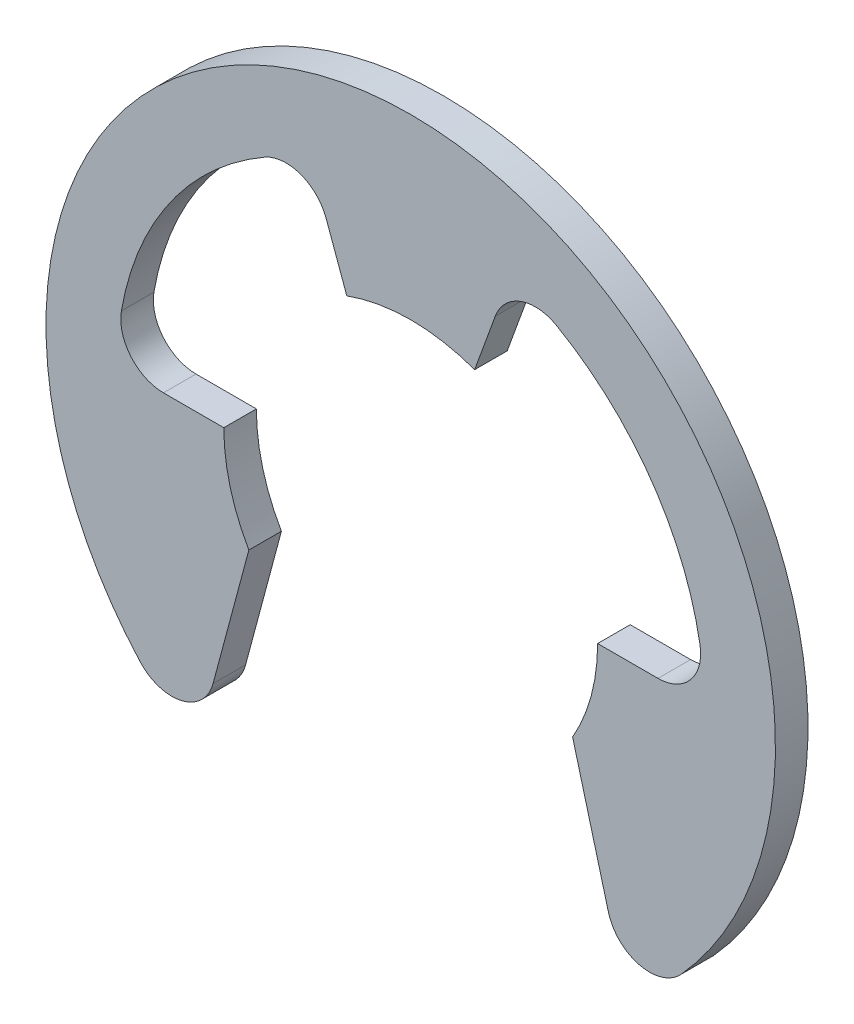
ISO-10303-21;
HEADER;
FILE_DESCRIPTION(('STEP AP214'),'2;1');
FILE_NAME('part.step','',(''),(''),'','','');
FILE_SCHEMA(('AUTOMOTIVE_DESIGN { 1 0 10303 214 1 1 1 1 }'));
ENDSEC;
DATA;
#1=APPLICATION_CONTEXT('core data for automotive mechanical design processes');
#2=APPLICATION_PROTOCOL_DEFINITION('international standard','automotive_design',2000,#1);
#3=PRODUCT_CONTEXT('',#1,'mechanical');
#4=PRODUCT('Part','Part','',(#3));
#5=PRODUCT_RELATED_PRODUCT_CATEGORY('part','',(#4));
#6=PRODUCT_DEFINITION_FORMATION('','',#4);
#7=PRODUCT_DEFINITION_CONTEXT('part definition',#1,'design');
#8=PRODUCT_DEFINITION('design','',#6,#7);
#9=PRODUCT_DEFINITION_SHAPE('','',#8);
#10=(LENGTH_UNIT() NAMED_UNIT(*) SI_UNIT(.MILLI.,.METRE.));
#11=(NAMED_UNIT(*) PLANE_ANGLE_UNIT() SI_UNIT($,.RADIAN.));
#12=(NAMED_UNIT(*) SI_UNIT($,.STERADIAN.) SOLID_ANGLE_UNIT());
#13=UNCERTAINTY_MEASURE_WITH_UNIT(LENGTH_MEASURE(1.E-05),#10,'distance_accuracy_value','');
#14=(GEOMETRIC_REPRESENTATION_CONTEXT(3) GLOBAL_UNCERTAINTY_ASSIGNED_CONTEXT((#13)) GLOBAL_UNIT_ASSIGNED_CONTEXT((#10,
#11,#12)) REPRESENTATION_CONTEXT('',''));
#15=CARTESIAN_POINT('',(0.,0.,0.));
#16=DIRECTION('',(0.,0.,1.));
#17=DIRECTION('',(1.,0.,0.));
#18=AXIS2_PLACEMENT_3D('',#15,#16,#17);
#19=CARTESIAN_POINT('',(0.,0.,-1.27));
#20=DIRECTION('',(0.,0.,1.));
#21=DIRECTION('',(1.,0.,0.));
#22=AXIS2_PLACEMENT_3D('',#19,#20,#21);
#23=CYLINDRICAL_SURFACE('',#22,7.2898);
#24=CARTESIAN_POINT('',(0.,0.,0.));
#25=DIRECTION('',(0.,0.,-1.));
#26=DIRECTION('',(1.,0.,0.));
#27=AXIS2_PLACEMENT_3D('',#24,#25,#26);
#28=CIRCLE('',#27,7.2898);
#29=CARTESIAN_POINT('',(7.2898,0.,0.));
#30=VERTEX_POINT('',#29);
#31=CARTESIAN_POINT('',(6.3131519885078,-3.64490000000001,0.));
#32=VERTEX_POINT('',#31);
#33=EDGE_CURVE('E190',#30,#32,#28,.T.);
#34=ORIENTED_EDGE('',*,*,#33,.F.);
#35=DIRECTION('',(0.,0.,1.));
#36=VECTOR('',#35,1.);
#37=CARTESIAN_POINT('',(7.2898,0.,-1.27));
#38=LINE('',#37,#36);
#39=CARTESIAN_POINT('',(7.2898,0.,-1.27));
#40=VERTEX_POINT('',#39);
#41=EDGE_CURVE('E11',#40,#30,#38,.T.);
#42=ORIENTED_EDGE('',*,*,#41,.F.);
#43=CARTESIAN_POINT('',(0.,0.,-1.27));
#44=DIRECTION('',(0.,0.,-1.));
#45=DIRECTION('',(1.,0.,0.));
#46=AXIS2_PLACEMENT_3D('',#43,#44,#45);
#47=CIRCLE('',#46,7.2898);
#48=CARTESIAN_POINT('',(6.3131519885078,-3.64490000000001,-1.27));
#49=VERTEX_POINT('',#48);
#50=EDGE_CURVE('E240',#40,#49,#47,.T.);
#51=ORIENTED_EDGE('',*,*,#50,.T.);
#52=DIRECTION('',(0.,0.,1.));
#53=VECTOR('',#52,1.);
#54=CARTESIAN_POINT('',(6.3131519885078,-3.64490000000001,-1.27));
#55=LINE('',#54,#53);
#56=EDGE_CURVE('E36',#49,#32,#55,.T.);
#57=ORIENTED_EDGE('',*,*,#56,.T.);
#58=EDGE_LOOP('',(#34,#42,#51,#57));
#59=FACE_BOUND('',#58,.T.);
#60=ADVANCED_FACE('F33',(#59),#23,.F.);
#61=CARTESIAN_POINT('',(7.2898,0.,-1.27));
#62=DIRECTION('',(0.,1.,0.));
#63=DIRECTION('',(-1.,0.,0.));
#64=AXIS2_PLACEMENT_3D('',#61,#62,#63);
#65=PLANE('',#64);
#66=DIRECTION('',(-1.,0.,0.));
#67=VECTOR('',#66,1.);
#68=CARTESIAN_POINT('',(7.2898,0.,0.));
#69=LINE('',#68,#67);
#70=CARTESIAN_POINT('',(9.64356779461212,0.,0.));
#71=VERTEX_POINT('',#70);
#72=EDGE_CURVE('E238',#71,#30,#69,.T.);
#73=ORIENTED_EDGE('',*,*,#72,.F.);
#74=DIRECTION('',(0.,0.,1.));
#75=VECTOR('',#74,1.);
#76=CARTESIAN_POINT('',(9.64356779461212,0.,-1.27));
#77=LINE('',#76,#75);
#78=CARTESIAN_POINT('',(9.64356779461212,0.,-1.27));
#79=VERTEX_POINT('',#78);
#80=EDGE_CURVE('E42',#79,#71,#77,.T.);
#81=ORIENTED_EDGE('',*,*,#80,.F.);
#82=DIRECTION('',(-1.,0.,0.));
#83=VECTOR('',#82,1.);
#84=CARTESIAN_POINT('',(7.2898,0.,-1.27));
#85=LINE('',#84,#83);
#86=EDGE_CURVE('E180',#79,#40,#85,.T.);
#87=ORIENTED_EDGE('',*,*,#86,.T.);
#88=ORIENTED_EDGE('',*,*,#41,.T.);
#89=EDGE_LOOP('',(#73,#81,#87,#88));
#90=FACE_BOUND('',#89,.T.);
#91=ADVANCED_FACE('F272',(#90),#65,.T.);
#92=CARTESIAN_POINT('',(9.64356779461212,1.664208,-1.27));
#93=DIRECTION('',(0.,0.,1.));
#94=DIRECTION('',(1.,0.,0.));
#95=AXIS2_PLACEMENT_3D('',#92,#93,#94);
#96=CYLINDRICAL_SURFACE('',#95,1.664208);
#97=CARTESIAN_POINT('',(9.64356779461212,1.664208,0.));
#98=DIRECTION('',(0.,0.,-1.));
#99=DIRECTION('',(1.,0.,0.));
#100=AXIS2_PLACEMENT_3D('',#97,#98,#99);
#101=CIRCLE('',#100,1.664208);
#102=CARTESIAN_POINT('',(11.2835349922424,1.94722011627907,0.));
#103=VERTEX_POINT('',#102);
#104=EDGE_CURVE('E167',#103,#71,#101,.T.);
#105=ORIENTED_EDGE('',*,*,#104,.F.);
#106=DIRECTION('',(0.,0.,1.));
#107=VECTOR('',#106,1.);
#108=CARTESIAN_POINT('',(11.2835349922424,1.94722011627907,-1.27));
#109=LINE('',#108,#107);
#110=CARTESIAN_POINT('',(11.2835349922424,1.94722011627907,-1.27));
#111=VERTEX_POINT('',#110);
#112=EDGE_CURVE('E162',#111,#103,#109,.T.);
#113=ORIENTED_EDGE('',*,*,#112,.F.);
#114=CARTESIAN_POINT('',(9.64356779461212,1.664208,-1.27));
#115=DIRECTION('',(0.,0.,-1.));
#116=DIRECTION('',(1.,0.,0.));
#117=AXIS2_PLACEMENT_3D('',#114,#115,#116);
#118=CIRCLE('',#117,1.664208);
#119=EDGE_CURVE('E165',#111,#79,#118,.T.);
#120=ORIENTED_EDGE('',*,*,#119,.T.);
#121=ORIENTED_EDGE('',*,*,#80,.T.);
#122=EDGE_LOOP('',(#105,#113,#120,#121));
#123=FACE_BOUND('',#122,.T.);
#124=ADVANCED_FACE('F164',(#123),#96,.F.);
#125=CARTESIAN_POINT('',(0.,0.,-1.27));
#126=DIRECTION('',(0.,0.,1.));
#127=DIRECTION('',(1.,0.,0.));
#128=AXIS2_PLACEMENT_3D('',#125,#126,#127);
#129=CYLINDRICAL_SURFACE('',#128,11.45032);
#130=CARTESIAN_POINT('',(0.,0.,0.));
#131=DIRECTION('',(0.,0.,-1.));
#132=DIRECTION('',(1.,0.,0.));
#133=AXIS2_PLACEMENT_3D('',#130,#131,#132);
#134=CIRCLE('',#133,11.45032);
#135=CARTESIAN_POINT('',(5.68898462958027,9.93706606533334,0.));
#136=VERTEX_POINT('',#135);
#137=EDGE_CURVE('E235',#136,#103,#134,.T.);
#138=ORIENTED_EDGE('',*,*,#137,.F.);
#139=DIRECTION('',(0.,0.,1.));
#140=VECTOR('',#139,1.);
#141=CARTESIAN_POINT('',(5.68898462958027,9.93706606533334,-1.27));
#142=LINE('',#141,#140);
#143=CARTESIAN_POINT('',(5.68898462958027,9.93706606533334,-1.27));
#144=VERTEX_POINT('',#143);
#145=EDGE_CURVE('E172',#144,#136,#142,.T.);
#146=ORIENTED_EDGE('',*,*,#145,.F.);
#147=CARTESIAN_POINT('',(0.,0.,-1.27));
#148=DIRECTION('',(0.,0.,-1.));
#149=DIRECTION('',(1.,0.,0.));
#150=AXIS2_PLACEMENT_3D('',#147,#148,#149);
#151=CIRCLE('',#150,11.45032);
#152=EDGE_CURVE('E178',#144,#111,#151,.T.);
#153=ORIENTED_EDGE('',*,*,#152,.T.);
#154=ORIENTED_EDGE('',*,*,#112,.T.);
#155=EDGE_LOOP('',(#138,#146,#153,#154));
#156=FACE_BOUND('',#155,.T.);
#157=ADVANCED_FACE('F182',(#156),#129,.F.);
#158=CARTESIAN_POINT('',(4.86213841633692,8.49279683596191,-1.27));
#159=DIRECTION('',(0.,0.,1.));
#160=DIRECTION('',(1.,0.,0.));
#161=AXIS2_PLACEMENT_3D('',#158,#159,#160);
#162=CYLINDRICAL_SURFACE('',#161,1.664208);
#163=CARTESIAN_POINT('',(4.86213841633692,8.49279683596191,0.));
#164=DIRECTION('',(0.,0.,-1.));
#165=DIRECTION('',(-1.,0.,0.));
#166=AXIS2_PLACEMENT_3D('',#163,#164,#165);
#167=CIRCLE('',#166,1.664208);
#168=CARTESIAN_POINT('',(3.29829443928405,9.06198949464564,0.));
#169=VERTEX_POINT('',#168);
#170=EDGE_CURVE('E232',#169,#136,#167,.T.);
#171=ORIENTED_EDGE('',*,*,#170,.F.);
#172=DIRECTION('',(0.,0.,1.));
#173=VECTOR('',#172,1.);
#174=CARTESIAN_POINT('',(3.29829443928405,9.06198949464564,-1.27));
#175=LINE('',#174,#173);
#176=CARTESIAN_POINT('',(3.29829443928405,9.06198949464564,-1.27));
#177=VERTEX_POINT('',#176);
#178=EDGE_CURVE('E244',#177,#169,#175,.T.);
#179=ORIENTED_EDGE('',*,*,#178,.F.);
#180=CARTESIAN_POINT('',(4.86213841633692,8.49279683596191,-1.27));
#181=DIRECTION('',(0.,0.,-1.));
#182=DIRECTION('',(-1.,0.,0.));
#183=AXIS2_PLACEMENT_3D('',#180,#181,#182);
#184=CIRCLE('',#183,1.664208);
#185=EDGE_CURVE('E183',#177,#144,#184,.T.);
#186=ORIENTED_EDGE('',*,*,#185,.T.);
#187=ORIENTED_EDGE('',*,*,#145,.T.);
#188=EDGE_LOOP('',(#171,#179,#186,#187));
#189=FACE_BOUND('',#188,.T.);
#190=ADVANCED_FACE('F285',(#189),#162,.F.);
#191=CARTESIAN_POINT('',(2.49325844081547,6.85017126700511,-1.27));
#192=DIRECTION('',(0.939692620785908,-0.34202014332567,0.));
#193=DIRECTION('',(0.34202014332567,0.939692620785908,0.));
#194=AXIS2_PLACEMENT_3D('',#191,#192,#193);
#195=PLANE('',#194);
#196=DIRECTION('',(0.34202014332567,0.939692620785908,0.));
#197=VECTOR('',#196,1.);
#198=CARTESIAN_POINT('',(2.49325844081547,6.85017126700511,0.));
#199=LINE('',#198,#197);
#200=CARTESIAN_POINT('',(2.49325844081547,6.85017126700511,0.));
#201=VERTEX_POINT('',#200);
#202=EDGE_CURVE('E229',#201,#169,#199,.T.);
#203=ORIENTED_EDGE('',*,*,#202,.F.);
#204=DIRECTION('',(0.,0.,1.));
#205=VECTOR('',#204,1.);
#206=CARTESIAN_POINT('',(2.49325844081547,6.85017126700511,-1.27));
#207=LINE('',#206,#205);
#208=CARTESIAN_POINT('',(2.49325844081547,6.85017126700511,-1.27));
#209=VERTEX_POINT('',#208);
#210=EDGE_CURVE('E246',#209,#201,#207,.T.);
#211=ORIENTED_EDGE('',*,*,#210,.F.);
#212=DIRECTION('',(0.34202014332567,0.939692620785908,0.));
#213=VECTOR('',#212,1.);
#214=CARTESIAN_POINT('',(2.49325844081547,6.85017126700511,-1.27));
#215=LINE('',#214,#213);
#216=EDGE_CURVE('E185',#209,#177,#215,.T.);
#217=ORIENTED_EDGE('',*,*,#216,.T.);
#218=ORIENTED_EDGE('',*,*,#178,.T.);
#219=EDGE_LOOP('',(#203,#211,#217,#218));
#220=FACE_BOUND('',#219,.T.);
#221=ADVANCED_FACE('F288',(#220),#195,.T.);
#222=CARTESIAN_POINT('',(0.,0.,-1.27));
#223=DIRECTION('',(0.,0.,1.));
#224=DIRECTION('',(1.,0.,0.));
#225=AXIS2_PLACEMENT_3D('',#222,#223,#224);
#226=CYLINDRICAL_SURFACE('',#225,7.2898);
#227=CARTESIAN_POINT('',(0.,0.,0.));
#228=DIRECTION('',(0.,0.,-1.));
#229=DIRECTION('',(1.,0.,0.));
#230=AXIS2_PLACEMENT_3D('',#227,#228,#229);
#231=CIRCLE('',#230,7.2898);
#232=CARTESIAN_POINT('',(-2.49325844081547,6.85017126700511,0.));
#233=VERTEX_POINT('',#232);
#234=EDGE_CURVE('E226',#233,#201,#231,.T.);
#235=ORIENTED_EDGE('',*,*,#234,.F.);
#236=DIRECTION('',(0.,0.,1.));
#237=VECTOR('',#236,1.);
#238=CARTESIAN_POINT('',(-2.49325844081547,6.85017126700511,-1.27));
#239=LINE('',#238,#237);
#240=CARTESIAN_POINT('',(-2.49325844081547,6.85017126700511,-1.27));
#241=VERTEX_POINT('',#240);
#242=EDGE_CURVE('E248',#241,#233,#239,.T.);
#243=ORIENTED_EDGE('',*,*,#242,.F.);
#244=CARTESIAN_POINT('',(0.,0.,-1.27));
#245=DIRECTION('',(0.,0.,-1.));
#246=DIRECTION('',(1.,0.,0.));
#247=AXIS2_PLACEMENT_3D('',#244,#245,#246);
#248=CIRCLE('',#247,7.2898);
#249=EDGE_CURVE('E496',#241,#209,#248,.T.);
#250=ORIENTED_EDGE('',*,*,#249,.T.);
#251=ORIENTED_EDGE('',*,*,#210,.T.);
#252=EDGE_LOOP('',(#235,#243,#250,#251));
#253=FACE_BOUND('',#252,.T.);
#254=ADVANCED_FACE('F292',(#253),#226,.F.);
#255=CARTESIAN_POINT('',(-2.49325844081547,6.85017126700511,-1.27));
#256=DIRECTION('',(-0.939692620785908,-0.34202014332567,0.));
#257=DIRECTION('',(0.34202014332567,-0.939692620785908,0.));
#258=AXIS2_PLACEMENT_3D('',#255,#256,#257);
#259=PLANE('',#258);
#260=DIRECTION('',(0.34202014332567,-0.939692620785908,0.));
#261=VECTOR('',#260,1.);
#262=CARTESIAN_POINT('',(-2.49325844081547,6.85017126700511,0.));
#263=LINE('',#262,#261);
#264=CARTESIAN_POINT('',(-3.29829443928405,9.06198949464564,0.));
#265=VERTEX_POINT('',#264);
#266=EDGE_CURVE('E223',#265,#233,#263,.T.);
#267=ORIENTED_EDGE('',*,*,#266,.F.);
#268=DIRECTION('',(0.,0.,1.));
#269=VECTOR('',#268,1.);
#270=CARTESIAN_POINT('',(-3.29829443928405,9.06198949464564,-1.27));
#271=LINE('',#270,#269);
#272=CARTESIAN_POINT('',(-3.29829443928405,9.06198949464564,-1.27));
#273=VERTEX_POINT('',#272);
#274=EDGE_CURVE('E250',#273,#265,#271,.T.);
#275=ORIENTED_EDGE('',*,*,#274,.F.);
#276=DIRECTION('',(0.34202014332567,-0.939692620785908,0.));
#277=VECTOR('',#276,1.);
#278=CARTESIAN_POINT('',(-2.49325844081547,6.85017126700511,-1.27));
#279=LINE('',#278,#277);
#280=EDGE_CURVE('E500',#273,#241,#279,.T.);
#281=ORIENTED_EDGE('',*,*,#280,.T.);
#282=ORIENTED_EDGE('',*,*,#242,.T.);
#283=EDGE_LOOP('',(#267,#275,#281,#282));
#284=FACE_BOUND('',#283,.T.);
#285=ADVANCED_FACE('F296',(#284),#259,.T.);
#286=CARTESIAN_POINT('',(-4.86213841633693,8.49279683596191,-1.27));
#287=DIRECTION('',(0.,0.,1.));
#288=DIRECTION('',(1.,0.,0.));
#289=AXIS2_PLACEMENT_3D('',#286,#287,#288);
#290=CYLINDRICAL_SURFACE('',#289,1.664208);
#291=CARTESIAN_POINT('',(-4.86213841633693,8.49279683596191,0.));
#292=DIRECTION('',(0.,0.,-1.));
#293=DIRECTION('',(1.,0.,0.));
#294=AXIS2_PLACEMENT_3D('',#291,#292,#293);
#295=CIRCLE('',#294,1.664208);
#296=CARTESIAN_POINT('',(-5.68898462958027,9.93706606533334,0.));
#297=VERTEX_POINT('',#296);
#298=EDGE_CURVE('E220',#297,#265,#295,.T.);
#299=ORIENTED_EDGE('',*,*,#298,.F.);
#300=DIRECTION('',(0.,0.,1.));
#301=VECTOR('',#300,1.);
#302=CARTESIAN_POINT('',(-5.68898462958027,9.93706606533334,-1.27));
#303=LINE('',#302,#301);
#304=CARTESIAN_POINT('',(-5.68898462958027,9.93706606533334,-1.27));
#305=VERTEX_POINT('',#304);
#306=EDGE_CURVE('E252',#305,#297,#303,.T.);
#307=ORIENTED_EDGE('',*,*,#306,.F.);
#308=CARTESIAN_POINT('',(-4.86213841633693,8.49279683596191,-1.27));
#309=DIRECTION('',(0.,0.,-1.));
#310=DIRECTION('',(1.,0.,0.));
#311=AXIS2_PLACEMENT_3D('',#308,#309,#310);
#312=CIRCLE('',#311,1.664208);
#313=EDGE_CURVE('E489',#305,#273,#312,.T.);
#314=ORIENTED_EDGE('',*,*,#313,.T.);
#315=ORIENTED_EDGE('',*,*,#274,.T.);
#316=EDGE_LOOP('',(#299,#307,#314,#315));
#317=FACE_BOUND('',#316,.T.);
#318=ADVANCED_FACE('F300',(#317),#290,.F.);
#319=CARTESIAN_POINT('',(0.,0.,-1.27));
#320=DIRECTION('',(0.,0.,1.));
#321=DIRECTION('',(1.,0.,0.));
#322=AXIS2_PLACEMENT_3D('',#319,#320,#321);
#323=CYLINDRICAL_SURFACE('',#322,11.45032);
#324=CARTESIAN_POINT('',(0.,0.,0.));
#325=DIRECTION('',(0.,0.,-1.));
#326=DIRECTION('',(1.,0.,0.));
#327=AXIS2_PLACEMENT_3D('',#324,#325,#326);
#328=CIRCLE('',#327,11.45032);
#329=CARTESIAN_POINT('',(-11.2835349922424,1.94722011627907,0.));
#330=VERTEX_POINT('',#329);
#331=EDGE_CURVE('E217',#330,#297,#328,.T.);
#332=ORIENTED_EDGE('',*,*,#331,.F.);
#333=DIRECTION('',(0.,0.,1.));
#334=VECTOR('',#333,1.);
#335=CARTESIAN_POINT('',(-11.2835349922424,1.94722011627907,-1.27));
#336=LINE('',#335,#334);
#337=CARTESIAN_POINT('',(-11.2835349922424,1.94722011627907,-1.27));
#338=VERTEX_POINT('',#337);
#339=EDGE_CURVE('E254',#338,#330,#336,.T.);
#340=ORIENTED_EDGE('',*,*,#339,.F.);
#341=CARTESIAN_POINT('',(0.,0.,-1.27));
#342=DIRECTION('',(0.,0.,-1.));
#343=DIRECTION('',(1.,0.,0.));
#344=AXIS2_PLACEMENT_3D('',#341,#342,#343);
#345=CIRCLE('',#344,11.45032);
#346=EDGE_CURVE('E485',#338,#305,#345,.T.);
#347=ORIENTED_EDGE('',*,*,#346,.T.);
#348=ORIENTED_EDGE('',*,*,#306,.T.);
#349=EDGE_LOOP('',(#332,#340,#347,#348));
#350=FACE_BOUND('',#349,.T.);
#351=ADVANCED_FACE('F304',(#350),#323,.F.);
#352=CARTESIAN_POINT('',(-9.64356779461212,1.664208,-1.27));
#353=DIRECTION('',(0.,0.,1.));
#354=DIRECTION('',(1.,0.,0.));
#355=AXIS2_PLACEMENT_3D('',#352,#353,#354);
#356=CYLINDRICAL_SURFACE('',#355,1.664208);
#357=CARTESIAN_POINT('',(-9.64356779461212,1.664208,0.));
#358=DIRECTION('',(0.,0.,-1.));
#359=DIRECTION('',(-1.,0.,0.));
#360=AXIS2_PLACEMENT_3D('',#357,#358,#359);
#361=CIRCLE('',#360,1.664208);
#362=CARTESIAN_POINT('',(-9.64356779461212,0.,0.));
#363=VERTEX_POINT('',#362);
#364=EDGE_CURVE('E214',#363,#330,#361,.T.);
#365=ORIENTED_EDGE('',*,*,#364,.F.);
#366=DIRECTION('',(0.,0.,1.));
#367=VECTOR('',#366,1.);
#368=CARTESIAN_POINT('',(-9.64356779461212,0.,-1.27));
#369=LINE('',#368,#367);
#370=CARTESIAN_POINT('',(-9.64356779461212,0.,-1.27));
#371=VERTEX_POINT('',#370);
#372=EDGE_CURVE('E256',#371,#363,#369,.T.);
#373=ORIENTED_EDGE('',*,*,#372,.F.);
#374=CARTESIAN_POINT('',(-9.64356779461212,1.664208,-1.27));
#375=DIRECTION('',(0.,0.,-1.));
#376=DIRECTION('',(-1.,0.,0.));
#377=AXIS2_PLACEMENT_3D('',#374,#375,#376);
#378=CIRCLE('',#377,1.664208);
#379=EDGE_CURVE('E506',#371,#338,#378,.T.);
#380=ORIENTED_EDGE('',*,*,#379,.T.);
#381=ORIENTED_EDGE('',*,*,#339,.T.);
#382=EDGE_LOOP('',(#365,#373,#380,#381));
#383=FACE_BOUND('',#382,.T.);
#384=ADVANCED_FACE('F308',(#383),#356,.F.);
#385=CARTESIAN_POINT('',(-7.2898,0.,-1.27));
#386=DIRECTION('',(0.,1.,0.));
#387=DIRECTION('',(-1.,0.,0.));
#388=AXIS2_PLACEMENT_3D('',#385,#386,#387);
#389=PLANE('',#388);
#390=DIRECTION('',(-1.,0.,0.));
#391=VECTOR('',#390,1.);
#392=CARTESIAN_POINT('',(-7.2898,0.,0.));
#393=LINE('',#392,#391);
#394=CARTESIAN_POINT('',(-7.2898,0.,0.));
#395=VERTEX_POINT('',#394);
#396=EDGE_CURVE('E211',#395,#363,#393,.T.);
#397=ORIENTED_EDGE('',*,*,#396,.F.);
#398=DIRECTION('',(0.,0.,1.));
#399=VECTOR('',#398,1.);
#400=CARTESIAN_POINT('',(-7.2898,0.,-1.27));
#401=LINE('',#400,#399);
#402=CARTESIAN_POINT('',(-7.2898,0.,-1.27));
#403=VERTEX_POINT('',#402);
#404=EDGE_CURVE('E258',#403,#395,#401,.T.);
#405=ORIENTED_EDGE('',*,*,#404,.F.);
#406=DIRECTION('',(-1.,0.,0.));
#407=VECTOR('',#406,1.);
#408=CARTESIAN_POINT('',(-7.2898,0.,-1.27));
#409=LINE('',#408,#407);
#410=EDGE_CURVE('E478',#403,#371,#409,.T.);
#411=ORIENTED_EDGE('',*,*,#410,.T.);
#412=ORIENTED_EDGE('',*,*,#372,.T.);
#413=EDGE_LOOP('',(#397,#405,#411,#412));
#414=FACE_BOUND('',#413,.T.);
#415=ADVANCED_FACE('F312',(#414),#389,.T.);
#416=CARTESIAN_POINT('',(0.,0.,-1.27));
#417=DIRECTION('',(0.,0.,1.));
#418=DIRECTION('',(1.,0.,0.));
#419=AXIS2_PLACEMENT_3D('',#416,#417,#418);
#420=CYLINDRICAL_SURFACE('',#419,7.2898);
#421=CARTESIAN_POINT('',(0.,0.,0.));
#422=DIRECTION('',(0.,0.,-1.));
#423=DIRECTION('',(1.,0.,0.));
#424=AXIS2_PLACEMENT_3D('',#421,#422,#423);
#425=CIRCLE('',#424,7.2898);
#426=CARTESIAN_POINT('',(-6.3131519885078,-3.64490000000001,0.));
#427=VERTEX_POINT('',#426);
#428=EDGE_CURVE('E208',#427,#395,#425,.T.);
#429=ORIENTED_EDGE('',*,*,#428,.F.);
#430=DIRECTION('',(0.,0.,1.));
#431=VECTOR('',#430,1.);
#432=CARTESIAN_POINT('',(-6.3131519885078,-3.64490000000001,-1.27));
#433=LINE('',#432,#431);
#434=CARTESIAN_POINT('',(-6.3131519885078,-3.64490000000001,-1.27));
#435=VERTEX_POINT('',#434);
#436=EDGE_CURVE('E260',#435,#427,#433,.T.);
#437=ORIENTED_EDGE('',*,*,#436,.F.);
#438=CARTESIAN_POINT('',(0.,0.,-1.27));
#439=DIRECTION('',(0.,0.,-1.));
#440=DIRECTION('',(1.,0.,0.));
#441=AXIS2_PLACEMENT_3D('',#438,#439,#440);
#442=CIRCLE('',#441,7.2898);
#443=EDGE_CURVE('E474',#435,#403,#442,.T.);
#444=ORIENTED_EDGE('',*,*,#443,.T.);
#445=ORIENTED_EDGE('',*,*,#404,.T.);
#446=EDGE_LOOP('',(#429,#437,#444,#445));
#447=FACE_BOUND('',#446,.T.);
#448=ADVANCED_FACE('F316',(#447),#420,.F.);
#449=CARTESIAN_POINT('',(-6.3131519885078,-3.64490000000001,-1.27));
#450=DIRECTION('',(0.965925826289068,-0.258819045102523,0.));
#451=DIRECTION('',(0.258819045102523,0.965925826289068,0.));
#452=AXIS2_PLACEMENT_3D('',#449,#450,#451);
#453=PLANE('',#452);
#454=DIRECTION('',(0.258819045102523,0.965925826289068,0.));
#455=VECTOR('',#454,1.);
#456=CARTESIAN_POINT('',(-6.3131519885078,-3.64490000000001,0.));
#457=LINE('',#456,#455);
#458=CARTESIAN_POINT('',(-7.70893904162257,-8.85404819877115,0.));
#459=VERTEX_POINT('',#458);
#460=EDGE_CURVE('E205',#459,#427,#457,.T.);
#461=ORIENTED_EDGE('',*,*,#460,.F.);
#462=DIRECTION('',(0.,0.,1.));
#463=VECTOR('',#462,1.);
#464=CARTESIAN_POINT('',(-7.70893904162257,-8.85404819877115,-1.27));
#465=LINE('',#464,#463);
#466=CARTESIAN_POINT('',(-7.70893904162257,-8.85404819877115,-1.27));
#467=VERTEX_POINT('',#466);
#468=EDGE_CURVE('E262',#467,#459,#465,.T.);
#469=ORIENTED_EDGE('',*,*,#468,.F.);
#470=DIRECTION('',(0.258819045102523,0.965925826289068,0.));
#471=VECTOR('',#470,1.);
#472=CARTESIAN_POINT('',(-6.3131519885078,-3.64490000000001,-1.27));
#473=LINE('',#472,#471);
#474=EDGE_CURVE('E510',#467,#435,#473,.T.);
#475=ORIENTED_EDGE('',*,*,#474,.T.);
#476=ORIENTED_EDGE('',*,*,#436,.T.);
#477=EDGE_LOOP('',(#461,#469,#475,#476));
#478=FACE_BOUND('',#477,.T.);
#479=ADVANCED_FACE('F320',(#478),#453,.T.);
#480=CARTESIAN_POINT('',(-9.31644052913944,-8.42331947335918,-1.27));
#481=DIRECTION('',(0.,0.,1.));
#482=DIRECTION('',(1.,0.,0.));
#483=AXIS2_PLACEMENT_3D('',#480,#481,#482);
#484=CYLINDRICAL_SURFACE('',#483,1.664208);
#485=CARTESIAN_POINT('',(-9.31644052913944,-8.42331947335918,0.));
#486=DIRECTION('',(0.,0.,1.));
#487=DIRECTION('',(-1.,0.,0.));
#488=AXIS2_PLACEMENT_3D('',#485,#486,#487);
#489=CIRCLE('',#488,1.664208);
#490=CARTESIAN_POINT('',(-10.5508952764886,-9.53943315216215,0.));
#491=VERTEX_POINT('',#490);
#492=EDGE_CURVE('E202',#491,#459,#489,.T.);
#493=ORIENTED_EDGE('',*,*,#492,.F.);
#494=DIRECTION('',(0.,0.,1.));
#495=VECTOR('',#494,1.);
#496=CARTESIAN_POINT('',(-10.5508952764886,-9.53943315216215,-1.27));
#497=LINE('',#496,#495);
#498=CARTESIAN_POINT('',(-10.5508952764886,-9.53943315216215,-1.27));
#499=VERTEX_POINT('',#498);
#500=EDGE_CURVE('E264',#499,#491,#497,.T.);
#501=ORIENTED_EDGE('',*,*,#500,.F.);
#502=CARTESIAN_POINT('',(-9.31644052913944,-8.42331947335918,-1.27));
#503=DIRECTION('',(0.,0.,1.));
#504=DIRECTION('',(-1.,0.,0.));
#505=AXIS2_PLACEMENT_3D('',#502,#503,#504);
#506=CIRCLE('',#505,1.664208);
#507=EDGE_CURVE('E467',#499,#467,#506,.T.);
#508=ORIENTED_EDGE('',*,*,#507,.T.);
#509=ORIENTED_EDGE('',*,*,#468,.T.);
#510=EDGE_LOOP('',(#493,#501,#508,#509));
#511=FACE_BOUND('',#510,.T.);
#512=ADVANCED_FACE('F324',(#511),#484,.T.);
#513=CARTESIAN_POINT('',(0.,0.,-1.27));
#514=DIRECTION('',(0.,0.,1.));
#515=DIRECTION('',(1.,0.,0.));
#516=AXIS2_PLACEMENT_3D('',#513,#514,#515);
#517=CYLINDRICAL_SURFACE('',#516,14.224);
#518=CARTESIAN_POINT('',(0.,0.,0.));
#519=DIRECTION('',(0.,0.,1.));
#520=DIRECTION('',(1.,0.,0.));
#521=AXIS2_PLACEMENT_3D('',#518,#519,#520);
#522=CIRCLE('',#521,14.224);
#523=CARTESIAN_POINT('',(10.5508952764886,-9.53943315216215,0.));
#524=VERTEX_POINT('',#523);
#525=EDGE_CURVE('E199',#524,#491,#522,.T.);
#526=ORIENTED_EDGE('',*,*,#525,.F.);
#527=DIRECTION('',(0.,0.,1.));
#528=VECTOR('',#527,1.);
#529=CARTESIAN_POINT('',(10.5508952764886,-9.53943315216215,-1.27));
#530=LINE('',#529,#528);
#531=CARTESIAN_POINT('',(10.5508952764886,-9.53943315216215,-1.27));
#532=VERTEX_POINT('',#531);
#533=EDGE_CURVE('E266',#532,#524,#530,.T.);
#534=ORIENTED_EDGE('',*,*,#533,.F.);
#535=CARTESIAN_POINT('',(0.,0.,-1.27));
#536=DIRECTION('',(0.,0.,1.));
#537=DIRECTION('',(1.,0.,0.));
#538=AXIS2_PLACEMENT_3D('',#535,#536,#537);
#539=CIRCLE('',#538,14.224);
#540=EDGE_CURVE('E463',#532,#499,#539,.T.);
#541=ORIENTED_EDGE('',*,*,#540,.T.);
#542=ORIENTED_EDGE('',*,*,#500,.T.);
#543=EDGE_LOOP('',(#526,#534,#541,#542));
#544=FACE_BOUND('',#543,.T.);
#545=ADVANCED_FACE('F328',(#544),#517,.T.);
#546=CARTESIAN_POINT('',(9.31644052913945,-8.42331947335917,-1.27));
#547=DIRECTION('',(0.,0.,1.));
#548=DIRECTION('',(1.,0.,0.));
#549=AXIS2_PLACEMENT_3D('',#546,#547,#548);
#550=CYLINDRICAL_SURFACE('',#549,1.664208);
#551=CARTESIAN_POINT('',(9.31644052913945,-8.42331947335917,0.));
#552=DIRECTION('',(0.,0.,1.));
#553=DIRECTION('',(1.,0.,0.));
#554=AXIS2_PLACEMENT_3D('',#551,#552,#553);
#555=CIRCLE('',#554,1.664208);
#556=CARTESIAN_POINT('',(7.70893904162257,-8.85404819877115,0.));
#557=VERTEX_POINT('',#556);
#558=EDGE_CURVE('E196',#557,#524,#555,.T.);
#559=ORIENTED_EDGE('',*,*,#558,.F.);
#560=DIRECTION('',(0.,0.,1.));
#561=VECTOR('',#560,1.);
#562=CARTESIAN_POINT('',(7.70893904162257,-8.85404819877115,-1.27));
#563=LINE('',#562,#561);
#564=CARTESIAN_POINT('',(7.70893904162257,-8.85404819877115,-1.27));
#565=VERTEX_POINT('',#564);
#566=EDGE_CURVE('E267',#565,#557,#563,.T.);
#567=ORIENTED_EDGE('',*,*,#566,.F.);
#568=CARTESIAN_POINT('',(9.31644052913945,-8.42331947335917,-1.27));
#569=DIRECTION('',(0.,0.,1.));
#570=DIRECTION('',(1.,0.,0.));
#571=AXIS2_PLACEMENT_3D('',#568,#569,#570);
#572=CIRCLE('',#571,1.664208);
#573=EDGE_CURVE('E514',#565,#532,#572,.T.);
#574=ORIENTED_EDGE('',*,*,#573,.T.);
#575=ORIENTED_EDGE('',*,*,#533,.T.);
#576=EDGE_LOOP('',(#559,#567,#574,#575));
#577=FACE_BOUND('',#576,.T.);
#578=ADVANCED_FACE('F332',(#577),#550,.T.);
#579=CARTESIAN_POINT('',(6.3131519885078,-3.64490000000001,-1.27));
#580=DIRECTION('',(-0.965925826289068,-0.258819045102523,0.));
#581=DIRECTION('',(0.258819045102523,-0.965925826289068,0.));
#582=AXIS2_PLACEMENT_3D('',#579,#580,#581);
#583=PLANE('',#582);
#584=DIRECTION('',(0.258819045102523,-0.965925826289068,0.));
#585=VECTOR('',#584,1.);
#586=CARTESIAN_POINT('',(6.3131519885078,-3.64490000000001,0.));
#587=LINE('',#586,#585);
#588=EDGE_CURVE('E193',#32,#557,#587,.T.);
#589=ORIENTED_EDGE('',*,*,#588,.F.);
#590=ORIENTED_EDGE('',*,*,#56,.F.);
#591=DIRECTION('',(0.258819045102523,-0.965925826289068,0.));
#592=VECTOR('',#591,1.);
#593=CARTESIAN_POINT('',(6.3131519885078,-3.64490000000001,-1.27));
#594=LINE('',#593,#592);
#595=EDGE_CURVE('E516',#49,#565,#594,.T.);
#596=ORIENTED_EDGE('',*,*,#595,.T.);
#597=ORIENTED_EDGE('',*,*,#566,.T.);
#598=EDGE_LOOP('',(#589,#590,#596,#597));
#599=FACE_BOUND('',#598,.T.);
#600=ADVANCED_FACE('F269',(#599),#583,.T.);
#601=CARTESIAN_POINT('',(0.,0.,-1.27));
#602=DIRECTION('',(0.,0.,1.));
#603=DIRECTION('',(1.,0.,0.));
#604=AXIS2_PLACEMENT_3D('',#601,#602,#603);
#605=PLANE('',#604);
#606=ORIENTED_EDGE('',*,*,#50,.F.);
#607=ORIENTED_EDGE('',*,*,#86,.F.);
#608=ORIENTED_EDGE('',*,*,#119,.F.);
#609=ORIENTED_EDGE('',*,*,#152,.F.);
#610=ORIENTED_EDGE('',*,*,#185,.F.);
#611=ORIENTED_EDGE('',*,*,#216,.F.);
#612=ORIENTED_EDGE('',*,*,#249,.F.);
#613=ORIENTED_EDGE('',*,*,#280,.F.);
#614=ORIENTED_EDGE('',*,*,#313,.F.);
#615=ORIENTED_EDGE('',*,*,#346,.F.);
#616=ORIENTED_EDGE('',*,*,#379,.F.);
#617=ORIENTED_EDGE('',*,*,#410,.F.);
#618=ORIENTED_EDGE('',*,*,#443,.F.);
#619=ORIENTED_EDGE('',*,*,#474,.F.);
#620=ORIENTED_EDGE('',*,*,#507,.F.);
#621=ORIENTED_EDGE('',*,*,#540,.F.);
#622=ORIENTED_EDGE('',*,*,#573,.F.);
#623=ORIENTED_EDGE('',*,*,#595,.F.);
#624=EDGE_LOOP('',(#606,#607,#608,#609,#610,#611,#612,#613,#614,#615,#616,#617,#618,#619,#620,
#621,#622,#623));
#625=FACE_BOUND('',#624,.T.);
#626=ADVANCED_FACE('F176',(#625),#605,.F.);
#627=CARTESIAN_POINT('',(0.,0.,0.));
#628=DIRECTION('',(0.,0.,1.));
#629=DIRECTION('',(1.,0.,0.));
#630=AXIS2_PLACEMENT_3D('',#627,#628,#629);
#631=PLANE('',#630);
#632=ORIENTED_EDGE('',*,*,#33,.T.);
#633=ORIENTED_EDGE('',*,*,#588,.T.);
#634=ORIENTED_EDGE('',*,*,#558,.T.);
#635=ORIENTED_EDGE('',*,*,#525,.T.);
#636=ORIENTED_EDGE('',*,*,#492,.T.);
#637=ORIENTED_EDGE('',*,*,#460,.T.);
#638=ORIENTED_EDGE('',*,*,#428,.T.);
#639=ORIENTED_EDGE('',*,*,#396,.T.);
#640=ORIENTED_EDGE('',*,*,#364,.T.);
#641=ORIENTED_EDGE('',*,*,#331,.T.);
#642=ORIENTED_EDGE('',*,*,#298,.T.);
#643=ORIENTED_EDGE('',*,*,#266,.T.);
#644=ORIENTED_EDGE('',*,*,#234,.T.);
#645=ORIENTED_EDGE('',*,*,#202,.T.);
#646=ORIENTED_EDGE('',*,*,#170,.T.);
#647=ORIENTED_EDGE('',*,*,#137,.T.);
#648=ORIENTED_EDGE('',*,*,#104,.T.);
#649=ORIENTED_EDGE('',*,*,#72,.T.);
#650=EDGE_LOOP('',(#632,#633,#634,#635,#636,#637,#638,#639,#640,#641,#642,#643,#644,#645,#646,
#647,#648,#649));
#651=FACE_BOUND('',#650,.T.);
#652=ADVANCED_FACE('F271',(#651),#631,.T.);
#653=CLOSED_SHELL('',(#60,#91,#124,#157,#190,#221,#254,#285,#318,#351,#384,#415,#448,#479,#512,
#545,#578,#600,#626,#652));
#654=MANIFOLD_SOLID_BREP('B2',#653);
#655=ADVANCED_BREP_SHAPE_REPRESENTATION('',(#18,#654),#14);
#656=SHAPE_DEFINITION_REPRESENTATION(#9,#655);
ENDSEC;
END-ISO-10303-21;
